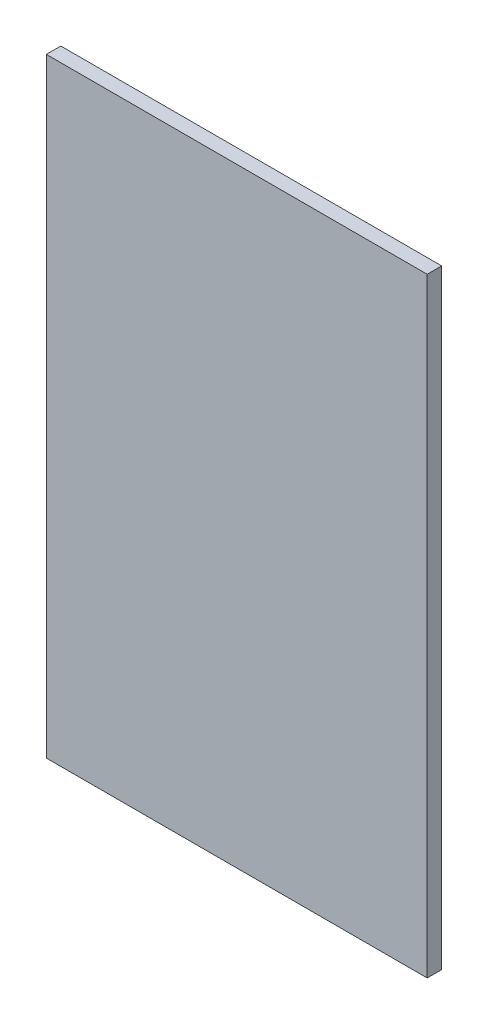
ISO-10303-21;
HEADER;
FILE_DESCRIPTION(('STEP AP214'),'2;1');
FILE_NAME('part.step','',(''),(''),'','','');
FILE_SCHEMA(('AUTOMOTIVE_DESIGN { 1 0 10303 214 1 1 1 1 }'));
ENDSEC;
DATA;
#1=APPLICATION_CONTEXT('core data for automotive mechanical design processes');
#2=APPLICATION_PROTOCOL_DEFINITION('international standard','automotive_design',2000,#1);
#3=PRODUCT_CONTEXT('',#1,'mechanical');
#4=PRODUCT('Part','Part','',(#3));
#5=PRODUCT_RELATED_PRODUCT_CATEGORY('part','',(#4));
#6=PRODUCT_DEFINITION_FORMATION('','',#4);
#7=PRODUCT_DEFINITION_CONTEXT('part definition',#1,'design');
#8=PRODUCT_DEFINITION('design','',#6,#7);
#9=PRODUCT_DEFINITION_SHAPE('','',#8);
#10=(LENGTH_UNIT() NAMED_UNIT(*) SI_UNIT(.MILLI.,.METRE.));
#11=(NAMED_UNIT(*) PLANE_ANGLE_UNIT() SI_UNIT($,.RADIAN.));
#12=(NAMED_UNIT(*) SI_UNIT($,.STERADIAN.) SOLID_ANGLE_UNIT());
#13=UNCERTAINTY_MEASURE_WITH_UNIT(LENGTH_MEASURE(1.E-05),#10,'distance_accuracy_value','');
#14=(GEOMETRIC_REPRESENTATION_CONTEXT(3) GLOBAL_UNCERTAINTY_ASSIGNED_CONTEXT((#13)) GLOBAL_UNIT_ASSIGNED_CONTEXT((#10,
#11,#12)) REPRESENTATION_CONTEXT('',''));
#15=CARTESIAN_POINT('',(0.,0.,0.));
#16=DIRECTION('',(0.,0.,1.));
#17=DIRECTION('',(1.,0.,0.));
#18=AXIS2_PLACEMENT_3D('',#15,#16,#17);
#19=CARTESIAN_POINT('',(0.,0.,19.));
#20=DIRECTION('',(1.,0.,0.));
#21=DIRECTION('',(0.,0.,-1.));
#22=AXIS2_PLACEMENT_3D('',#19,#20,#21);
#23=PLANE('',#22);
#24=DIRECTION('',(0.,-1.,0.));
#25=VECTOR('',#24,1.);
#26=CARTESIAN_POINT('',(0.,0.,0.));
#27=LINE('',#26,#25);
#28=CARTESIAN_POINT('',(0.,800.,0.));
#29=VERTEX_POINT('',#28);
#30=CARTESIAN_POINT('',(0.,0.,0.));
#31=VERTEX_POINT('',#30);
#32=EDGE_CURVE('E96',#29,#31,#27,.T.);
#33=ORIENTED_EDGE('',*,*,#32,.T.);
#34=DIRECTION('',(0.,0.,-1.));
#35=VECTOR('',#34,1.);
#36=CARTESIAN_POINT('',(0.,0.,19.));
#37=LINE('',#36,#35);
#38=CARTESIAN_POINT('',(0.,0.,19.));
#39=VERTEX_POINT('',#38);
#40=EDGE_CURVE('E11',#39,#31,#37,.T.);
#41=ORIENTED_EDGE('',*,*,#40,.F.);
#42=DIRECTION('',(0.,-1.,0.));
#43=VECTOR('',#42,1.);
#44=CARTESIAN_POINT('',(0.,0.,19.));
#45=LINE('',#44,#43);
#46=CARTESIAN_POINT('',(0.,800.,19.));
#47=VERTEX_POINT('',#46);
#48=EDGE_CURVE('E84',#47,#39,#45,.T.);
#49=ORIENTED_EDGE('',*,*,#48,.F.);
#50=DIRECTION('',(0.,0.,-1.));
#51=VECTOR('',#50,1.);
#52=CARTESIAN_POINT('',(0.,800.,19.));
#53=LINE('',#52,#51);
#54=EDGE_CURVE('E92',#47,#29,#53,.T.);
#55=ORIENTED_EDGE('',*,*,#54,.T.);
#56=EDGE_LOOP('',(#33,#41,#49,#55));
#57=FACE_BOUND('',#56,.T.);
#58=ADVANCED_FACE('F33',(#57),#23,.F.);
#59=CARTESIAN_POINT('',(0.,0.,19.));
#60=DIRECTION('',(0.,1.,0.));
#61=DIRECTION('',(0.,0.,1.));
#62=AXIS2_PLACEMENT_3D('',#59,#60,#61);
#63=PLANE('',#62);
#64=DIRECTION('',(1.,0.,0.));
#65=VECTOR('',#64,1.);
#66=CARTESIAN_POINT('',(0.,0.,0.));
#67=LINE('',#66,#65);
#68=CARTESIAN_POINT('',(500.,0.,0.));
#69=VERTEX_POINT('',#68);
#70=EDGE_CURVE('E88',#31,#69,#67,.T.);
#71=ORIENTED_EDGE('',*,*,#70,.T.);
#72=DIRECTION('',(0.,0.,-1.));
#73=VECTOR('',#72,1.);
#74=CARTESIAN_POINT('',(500.,0.,19.));
#75=LINE('',#74,#73);
#76=CARTESIAN_POINT('',(500.,0.,19.));
#77=VERTEX_POINT('',#76);
#78=EDGE_CURVE('E41',#77,#69,#75,.T.);
#79=ORIENTED_EDGE('',*,*,#78,.F.);
#80=DIRECTION('',(1.,0.,0.));
#81=VECTOR('',#80,1.);
#82=CARTESIAN_POINT('',(0.,0.,19.));
#83=LINE('',#82,#81);
#84=EDGE_CURVE('E79',#39,#77,#83,.T.);
#85=ORIENTED_EDGE('',*,*,#84,.F.);
#86=ORIENTED_EDGE('',*,*,#40,.T.);
#87=EDGE_LOOP('',(#71,#79,#85,#86));
#88=FACE_BOUND('',#87,.T.);
#89=ADVANCED_FACE('F87',(#88),#63,.F.);
#90=CARTESIAN_POINT('',(500.,0.,19.));
#91=DIRECTION('',(-1.,0.,0.));
#92=DIRECTION('',(0.,0.,1.));
#93=AXIS2_PLACEMENT_3D('',#90,#91,#92);
#94=PLANE('',#93);
#95=DIRECTION('',(0.,1.,0.));
#96=VECTOR('',#95,1.);
#97=CARTESIAN_POINT('',(500.,0.,0.));
#98=LINE('',#97,#96);
#99=CARTESIAN_POINT('',(500.,800.,0.));
#100=VERTEX_POINT('',#99);
#101=EDGE_CURVE('E66',#69,#100,#98,.T.);
#102=ORIENTED_EDGE('',*,*,#101,.T.);
#103=DIRECTION('',(0.,0.,-1.));
#104=VECTOR('',#103,1.);
#105=CARTESIAN_POINT('',(500.,800.,19.));
#106=LINE('',#105,#104);
#107=CARTESIAN_POINT('',(500.,800.,19.));
#108=VERTEX_POINT('',#107);
#109=EDGE_CURVE('E89',#108,#100,#106,.T.);
#110=ORIENTED_EDGE('',*,*,#109,.F.);
#111=DIRECTION('',(0.,1.,0.));
#112=VECTOR('',#111,1.);
#113=CARTESIAN_POINT('',(500.,0.,19.));
#114=LINE('',#113,#112);
#115=EDGE_CURVE('E82',#77,#108,#114,.T.);
#116=ORIENTED_EDGE('',*,*,#115,.F.);
#117=ORIENTED_EDGE('',*,*,#78,.T.);
#118=EDGE_LOOP('',(#102,#110,#116,#117));
#119=FACE_BOUND('',#118,.T.);
#120=ADVANCED_FACE('F90',(#119),#94,.F.);
#121=CARTESIAN_POINT('',(0.,800.,19.));
#122=DIRECTION('',(0.,-1.,0.));
#123=DIRECTION('',(0.,0.,-1.));
#124=AXIS2_PLACEMENT_3D('',#121,#122,#123);
#125=PLANE('',#124);
#126=DIRECTION('',(-1.,0.,0.));
#127=VECTOR('',#126,1.);
#128=CARTESIAN_POINT('',(0.,800.,0.));
#129=LINE('',#128,#127);
#130=EDGE_CURVE('E72',#100,#29,#129,.T.);
#131=ORIENTED_EDGE('',*,*,#130,.T.);
#132=ORIENTED_EDGE('',*,*,#54,.F.);
#133=DIRECTION('',(-1.,0.,0.));
#134=VECTOR('',#133,1.);
#135=CARTESIAN_POINT('',(0.,800.,19.));
#136=LINE('',#135,#134);
#137=EDGE_CURVE('E49',#108,#47,#136,.T.);
#138=ORIENTED_EDGE('',*,*,#137,.F.);
#139=ORIENTED_EDGE('',*,*,#109,.T.);
#140=EDGE_LOOP('',(#131,#132,#138,#139));
#141=FACE_BOUND('',#140,.T.);
#142=ADVANCED_FACE('F103',(#141),#125,.F.);
#143=CARTESIAN_POINT('',(0.,0.,19.));
#144=DIRECTION('',(0.,0.,-1.));
#145=DIRECTION('',(-1.,0.,0.));
#146=AXIS2_PLACEMENT_3D('',#143,#144,#145);
#147=PLANE('',#146);
#148=ORIENTED_EDGE('',*,*,#48,.T.);
#149=ORIENTED_EDGE('',*,*,#84,.T.);
#150=ORIENTED_EDGE('',*,*,#115,.T.);
#151=ORIENTED_EDGE('',*,*,#137,.T.);
#152=EDGE_LOOP('',(#148,#149,#150,#151));
#153=FACE_BOUND('',#152,.T.);
#154=ADVANCED_FACE('F80',(#153),#147,.F.);
#155=CARTESIAN_POINT('',(0.,0.,0.));
#156=DIRECTION('',(0.,0.,-1.));
#157=DIRECTION('',(-1.,0.,0.));
#158=AXIS2_PLACEMENT_3D('',#155,#156,#157);
#159=PLANE('',#158);
#160=ORIENTED_EDGE('',*,*,#32,.F.);
#161=ORIENTED_EDGE('',*,*,#130,.F.);
#162=ORIENTED_EDGE('',*,*,#101,.F.);
#163=ORIENTED_EDGE('',*,*,#70,.F.);
#164=EDGE_LOOP('',(#160,#161,#162,#163));
#165=FACE_BOUND('',#164,.T.);
#166=ADVANCED_FACE('F106',(#165),#159,.T.);
#167=CLOSED_SHELL('',(#58,#89,#120,#142,#154,#166));
#168=MANIFOLD_SOLID_BREP('B2',#167);
#169=ADVANCED_BREP_SHAPE_REPRESENTATION('',(#18,#168),#14);
#170=SHAPE_DEFINITION_REPRESENTATION(#9,#169);
ENDSEC;
END-ISO-10303-21;
